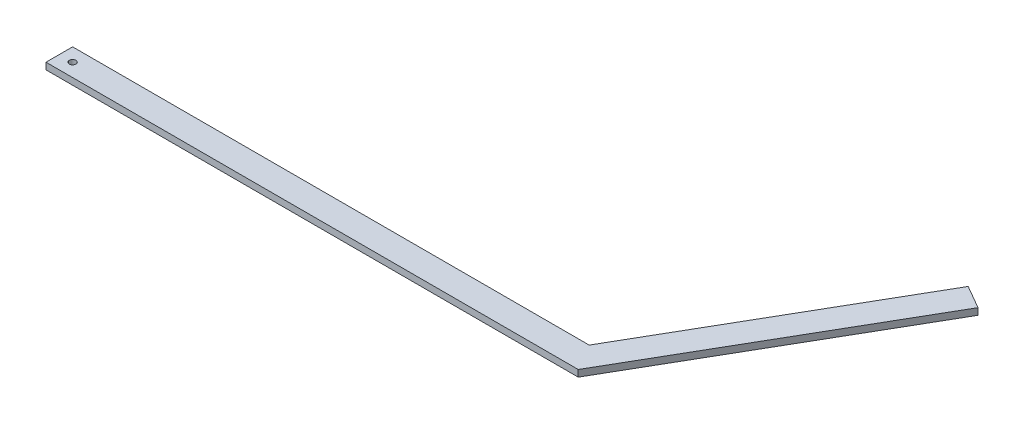
ISO-10303-21;
HEADER;
FILE_DESCRIPTION(('STEP AP214'),'2;1');
FILE_NAME('part.step','',(''),(''),'','','');
FILE_SCHEMA(('AUTOMOTIVE_DESIGN { 1 0 10303 214 1 1 1 1 }'));
ENDSEC;
DATA;
#1=APPLICATION_CONTEXT('core data for automotive mechanical design processes');
#2=APPLICATION_PROTOCOL_DEFINITION('international standard','automotive_design',2000,#1);
#3=PRODUCT_CONTEXT('',#1,'mechanical');
#4=PRODUCT('Part','Part','',(#3));
#5=PRODUCT_RELATED_PRODUCT_CATEGORY('part','',(#4));
#6=PRODUCT_DEFINITION_FORMATION('','',#4);
#7=PRODUCT_DEFINITION_CONTEXT('part definition',#1,'design');
#8=PRODUCT_DEFINITION('design','',#6,#7);
#9=PRODUCT_DEFINITION_SHAPE('','',#8);
#10=(LENGTH_UNIT() NAMED_UNIT(*) SI_UNIT(.MILLI.,.METRE.));
#11=(NAMED_UNIT(*) PLANE_ANGLE_UNIT() SI_UNIT($,.RADIAN.));
#12=(NAMED_UNIT(*) SI_UNIT($,.STERADIAN.) SOLID_ANGLE_UNIT());
#13=UNCERTAINTY_MEASURE_WITH_UNIT(LENGTH_MEASURE(1.E-05),#10,'distance_accuracy_value','');
#14=(GEOMETRIC_REPRESENTATION_CONTEXT(3) GLOBAL_UNCERTAINTY_ASSIGNED_CONTEXT((#13)) GLOBAL_UNIT_ASSIGNED_CONTEXT((#10,
#11,#12)) REPRESENTATION_CONTEXT('',''));
#15=CARTESIAN_POINT('',(0.,0.,0.));
#16=DIRECTION('',(0.,0.,1.));
#17=DIRECTION('',(1.,0.,0.));
#18=AXIS2_PLACEMENT_3D('',#15,#16,#17);
#19=CARTESIAN_POINT('',(0.,6.35,0.));
#20=DIRECTION('',(1.,0.,0.));
#21=DIRECTION('',(0.,0.,-1.));
#22=AXIS2_PLACEMENT_3D('',#19,#20,#21);
#23=PLANE('',#22);
#24=DIRECTION('',(0.,0.,1.));
#25=VECTOR('',#24,1.);
#26=CARTESIAN_POINT('',(0.,0.,0.));
#27=LINE('',#26,#25);
#28=CARTESIAN_POINT('',(0.,0.,-25.4));
#29=VERTEX_POINT('',#28);
#30=CARTESIAN_POINT('',(0.,0.,0.));
#31=VERTEX_POINT('',#30);
#32=EDGE_CURVE('E117',#29,#31,#27,.T.);
#33=ORIENTED_EDGE('',*,*,#32,.T.);
#34=DIRECTION('',(0.,-1.,0.));
#35=VECTOR('',#34,1.);
#36=CARTESIAN_POINT('',(0.,6.35,0.));
#37=LINE('',#36,#35);
#38=CARTESIAN_POINT('',(0.,6.35,0.));
#39=VERTEX_POINT('',#38);
#40=EDGE_CURVE('E11',#39,#31,#37,.T.);
#41=ORIENTED_EDGE('',*,*,#40,.F.);
#42=DIRECTION('',(0.,0.,1.));
#43=VECTOR('',#42,1.);
#44=CARTESIAN_POINT('',(0.,6.35,0.));
#45=LINE('',#44,#43);
#46=CARTESIAN_POINT('',(0.,6.35,-25.4));
#47=VERTEX_POINT('',#46);
#48=EDGE_CURVE('E128',#47,#39,#45,.T.);
#49=ORIENTED_EDGE('',*,*,#48,.F.);
#50=DIRECTION('',(0.,-1.,0.));
#51=VECTOR('',#50,1.);
#52=CARTESIAN_POINT('',(0.,6.35,-25.4));
#53=LINE('',#52,#51);
#54=EDGE_CURVE('E113',#47,#29,#53,.T.);
#55=ORIENTED_EDGE('',*,*,#54,.T.);
#56=EDGE_LOOP('',(#33,#41,#49,#55));
#57=FACE_BOUND('',#56,.T.);
#58=ADVANCED_FACE('F33',(#57),#23,.F.);
#59=CARTESIAN_POINT('',(508.,6.35,0.));
#60=DIRECTION('',(0.,0.,-1.));
#61=DIRECTION('',(-1.,0.,0.));
#62=AXIS2_PLACEMENT_3D('',#59,#60,#61);
#63=PLANE('',#62);
#64=DIRECTION('',(1.,0.,0.));
#65=VECTOR('',#64,1.);
#66=CARTESIAN_POINT('',(508.,0.,0.));
#67=LINE('',#66,#65);
#68=CARTESIAN_POINT('',(508.,0.,0.));
#69=VERTEX_POINT('',#68);
#70=EDGE_CURVE('E120',#31,#69,#67,.T.);
#71=ORIENTED_EDGE('',*,*,#70,.T.);
#72=DIRECTION('',(0.,-1.,0.));
#73=VECTOR('',#72,1.);
#74=CARTESIAN_POINT('',(508.,6.35,0.));
#75=LINE('',#74,#73);
#76=CARTESIAN_POINT('',(508.,6.35,0.));
#77=VERTEX_POINT('',#76);
#78=EDGE_CURVE('E41',#77,#69,#75,.T.);
#79=ORIENTED_EDGE('',*,*,#78,.F.);
#80=DIRECTION('',(1.,0.,0.));
#81=VECTOR('',#80,1.);
#82=CARTESIAN_POINT('',(508.,6.35,0.));
#83=LINE('',#82,#81);
#84=EDGE_CURVE('E86',#39,#77,#83,.T.);
#85=ORIENTED_EDGE('',*,*,#84,.F.);
#86=ORIENTED_EDGE('',*,*,#40,.T.);
#87=EDGE_LOOP('',(#71,#79,#85,#86));
#88=FACE_BOUND('',#87,.T.);
#89=ADVANCED_FACE('F153',(#88),#63,.F.);
#90=CARTESIAN_POINT('',(508.,6.35,0.));
#91=DIRECTION('',(-0.866025403784436,0.,-0.500000000000004));
#92=DIRECTION('',(-0.500000000000004,0.,0.866025403784437));
#93=AXIS2_PLACEMENT_3D('',#90,#91,#92);
#94=PLANE('',#93);
#95=DIRECTION('',(0.500000000000004,0.,-0.866025403784436));
#96=VECTOR('',#95,1.);
#97=CARTESIAN_POINT('',(508.,0.,0.));
#98=LINE('',#97,#96);
#99=CARTESIAN_POINT('',(647.668283708857,0.,-241.912563589683));
#100=VERTEX_POINT('',#99);
#101=EDGE_CURVE('E123',#69,#100,#98,.T.);
#102=ORIENTED_EDGE('',*,*,#101,.T.);
#103=DIRECTION('',(0.,-1.,0.));
#104=VECTOR('',#103,1.);
#105=CARTESIAN_POINT('',(647.668283708857,6.35,-241.912563589683));
#106=LINE('',#105,#104);
#107=CARTESIAN_POINT('',(647.668283708857,6.35,-241.912563589683));
#108=VERTEX_POINT('',#107);
#109=EDGE_CURVE('E108',#108,#100,#106,.T.);
#110=ORIENTED_EDGE('',*,*,#109,.F.);
#111=DIRECTION('',(0.500000000000004,0.,-0.866025403784436));
#112=VECTOR('',#111,1.);
#113=CARTESIAN_POINT('',(508.,6.35,0.));
#114=LINE('',#113,#112);
#115=EDGE_CURVE('E99',#77,#108,#114,.T.);
#116=ORIENTED_EDGE('',*,*,#115,.F.);
#117=ORIENTED_EDGE('',*,*,#78,.T.);
#118=EDGE_LOOP('',(#102,#110,#116,#117));
#119=FACE_BOUND('',#118,.T.);
#120=ADVANCED_FACE('F134',(#119),#94,.F.);
#121=CARTESIAN_POINT('',(647.668283708857,6.35,-241.912563589683));
#122=DIRECTION('',(-0.500000000000004,0.,0.866025403784436));
#123=DIRECTION('',(0.866025403784437,0.,0.500000000000004));
#124=AXIS2_PLACEMENT_3D('',#121,#122,#123);
#125=PLANE('',#124);
#126=DIRECTION('',(-0.866025403784437,0.,-0.500000000000004));
#127=VECTOR('',#126,1.);
#128=CARTESIAN_POINT('',(647.668283708857,0.,-241.912563589683));
#129=LINE('',#128,#127);
#130=CARTESIAN_POINT('',(625.462629920212,0.,-254.733003782088));
#131=VERTEX_POINT('',#130);
#132=EDGE_CURVE('E107',#100,#131,#129,.T.);
#133=ORIENTED_EDGE('',*,*,#132,.T.);
#134=DIRECTION('',(0.,-1.,0.));
#135=VECTOR('',#134,1.);
#136=CARTESIAN_POINT('',(625.462629920212,6.35,-254.733003782088));
#137=LINE('',#136,#135);
#138=CARTESIAN_POINT('',(625.462629920212,6.35,-254.733003782088));
#139=VERTEX_POINT('',#138);
#140=EDGE_CURVE('E104',#139,#131,#137,.T.);
#141=ORIENTED_EDGE('',*,*,#140,.F.);
#142=DIRECTION('',(-0.866025403784437,0.,-0.500000000000004));
#143=VECTOR('',#142,1.);
#144=CARTESIAN_POINT('',(647.668283708857,6.35,-241.912563589683));
#145=LINE('',#144,#143);
#146=EDGE_CURVE('E93',#108,#139,#145,.T.);
#147=ORIENTED_EDGE('',*,*,#146,.F.);
#148=ORIENTED_EDGE('',*,*,#109,.T.);
#149=EDGE_LOOP('',(#133,#141,#147,#148));
#150=FACE_BOUND('',#149,.T.);
#151=ADVANCED_FACE('F105',(#150),#125,.F.);
#152=CARTESIAN_POINT('',(625.462629920212,6.35,-254.733003782088));
#153=DIRECTION('',(0.866025403784436,0.,0.500000000000004));
#154=DIRECTION('',(0.500000000000004,0.,-0.866025403784437));
#155=AXIS2_PLACEMENT_3D('',#152,#153,#154);
#156=PLANE('',#155);
#157=DIRECTION('',(-0.500000000000004,0.,0.866025403784436));
#158=VECTOR('',#157,1.);
#159=CARTESIAN_POINT('',(625.462629920212,0.,-254.733003782088));
#160=LINE('',#159,#158);
#161=CARTESIAN_POINT('',(493.057158452557,0.,-25.4));
#162=VERTEX_POINT('',#161);
#163=EDGE_CURVE('E72',#131,#162,#160,.T.);
#164=ORIENTED_EDGE('',*,*,#163,.T.);
#165=DIRECTION('',(0.,-1.,0.));
#166=VECTOR('',#165,1.);
#167=CARTESIAN_POINT('',(493.057158452557,6.35,-25.4));
#168=LINE('',#167,#166);
#169=CARTESIAN_POINT('',(493.057158452557,6.35,-25.4));
#170=VERTEX_POINT('',#169);
#171=EDGE_CURVE('E109',#170,#162,#168,.T.);
#172=ORIENTED_EDGE('',*,*,#171,.F.);
#173=DIRECTION('',(-0.500000000000004,0.,0.866025403784436));
#174=VECTOR('',#173,1.);
#175=CARTESIAN_POINT('',(625.462629920212,6.35,-254.733003782088));
#176=LINE('',#175,#174);
#177=EDGE_CURVE('E97',#139,#170,#176,.T.);
#178=ORIENTED_EDGE('',*,*,#177,.F.);
#179=ORIENTED_EDGE('',*,*,#140,.T.);
#180=EDGE_LOOP('',(#164,#172,#178,#179));
#181=FACE_BOUND('',#180,.T.);
#182=ADVANCED_FACE('F111',(#181),#156,.F.);
#183=CARTESIAN_POINT('',(0.,6.35,-25.4));
#184=DIRECTION('',(0.,0.,1.));
#185=DIRECTION('',(1.,0.,0.));
#186=AXIS2_PLACEMENT_3D('',#183,#184,#185);
#187=PLANE('',#186);
#188=DIRECTION('',(-1.,0.,0.));
#189=VECTOR('',#188,1.);
#190=CARTESIAN_POINT('',(0.,0.,-25.4));
#191=LINE('',#190,#189);
#192=EDGE_CURVE('E78',#162,#29,#191,.T.);
#193=ORIENTED_EDGE('',*,*,#192,.T.);
#194=ORIENTED_EDGE('',*,*,#54,.F.);
#195=DIRECTION('',(-1.,0.,0.));
#196=VECTOR('',#195,1.);
#197=CARTESIAN_POINT('',(0.,6.35,-25.4));
#198=LINE('',#197,#196);
#199=EDGE_CURVE('E49',#170,#47,#198,.T.);
#200=ORIENTED_EDGE('',*,*,#199,.F.);
#201=ORIENTED_EDGE('',*,*,#171,.T.);
#202=EDGE_LOOP('',(#193,#194,#200,#201));
#203=FACE_BOUND('',#202,.T.);
#204=ADVANCED_FACE('F141',(#203),#187,.F.);
#205=CARTESIAN_POINT('',(0.,6.35,0.));
#206=DIRECTION('',(0.,-1.,0.));
#207=DIRECTION('',(0.,0.,-1.));
#208=AXIS2_PLACEMENT_3D('',#205,#206,#207);
#209=PLANE('',#208);
#210=CARTESIAN_POINT('',(12.7,6.35,-12.7));
#211=DIRECTION('',(0.,1.,0.));
#212=DIRECTION('',(0.,0.,1.));
#213=AXIS2_PLACEMENT_3D('',#210,#211,#212);
#214=CIRCLE('',#213,3.175);
#215=CARTESIAN_POINT('',(12.7,6.35,-9.525));
#216=VERTEX_POINT('',#215);
#217=EDGE_CURVE('E208',#216,#216,#214,.T.);
#218=ORIENTED_EDGE('',*,*,#217,.F.);
#219=EDGE_LOOP('',(#218));
#220=FACE_BOUND('',#219,.T.);
#221=ORIENTED_EDGE('',*,*,#48,.T.);
#222=ORIENTED_EDGE('',*,*,#84,.T.);
#223=ORIENTED_EDGE('',*,*,#115,.T.);
#224=ORIENTED_EDGE('',*,*,#146,.T.);
#225=ORIENTED_EDGE('',*,*,#177,.T.);
#226=ORIENTED_EDGE('',*,*,#199,.T.);
#227=EDGE_LOOP('',(#221,#222,#223,#224,#225,#226));
#228=FACE_BOUND('',#227,.T.);
#229=ADVANCED_FACE('F95',(#220,#228),#209,.F.);
#230=CARTESIAN_POINT('',(0.,0.,0.));
#231=DIRECTION('',(0.,-1.,0.));
#232=DIRECTION('',(0.,0.,-1.));
#233=AXIS2_PLACEMENT_3D('',#230,#231,#232);
#234=PLANE('',#233);
#235=CARTESIAN_POINT('',(12.7,0.,-12.7));
#236=DIRECTION('',(0.,1.,0.));
#237=DIRECTION('',(0.,0.,1.));
#238=AXIS2_PLACEMENT_3D('',#235,#236,#237);
#239=CIRCLE('',#238,3.175);
#240=CARTESIAN_POINT('',(12.7,0.,-9.525));
#241=VERTEX_POINT('',#240);
#242=EDGE_CURVE('E121',#241,#241,#239,.T.);
#243=ORIENTED_EDGE('',*,*,#242,.T.);
#244=EDGE_LOOP('',(#243));
#245=FACE_BOUND('',#244,.T.);
#246=ORIENTED_EDGE('',*,*,#32,.F.);
#247=ORIENTED_EDGE('',*,*,#192,.F.);
#248=ORIENTED_EDGE('',*,*,#163,.F.);
#249=ORIENTED_EDGE('',*,*,#132,.F.);
#250=ORIENTED_EDGE('',*,*,#101,.F.);
#251=ORIENTED_EDGE('',*,*,#70,.F.);
#252=EDGE_LOOP('',(#246,#247,#248,#249,#250,#251));
#253=FACE_BOUND('',#252,.T.);
#254=ADVANCED_FACE('F137',(#245,#253),#234,.T.);
#255=CARTESIAN_POINT('',(12.7,0.,-12.7));
#256=DIRECTION('',(0.,1.,0.));
#257=DIRECTION('',(0.,0.,1.));
#258=AXIS2_PLACEMENT_3D('',#255,#256,#257);
#259=CYLINDRICAL_SURFACE('',#258,3.175);
#260=ORIENTED_EDGE('',*,*,#242,.F.);
#261=EDGE_LOOP('',(#260));
#262=FACE_BOUND('',#261,.T.);
#263=ORIENTED_EDGE('',*,*,#217,.T.);
#264=EDGE_LOOP('',(#263));
#265=FACE_BOUND('',#264,.T.);
#266=ADVANCED_FACE('F190',(#262,#265),#259,.F.);
#267=CLOSED_SHELL('',(#58,#89,#120,#151,#182,#204,#229,#254,#266));
#268=MANIFOLD_SOLID_BREP('B2',#267);
#269=ADVANCED_BREP_SHAPE_REPRESENTATION('',(#18,#268),#14);
#270=SHAPE_DEFINITION_REPRESENTATION(#9,#269);
ENDSEC;
END-ISO-10303-21;
